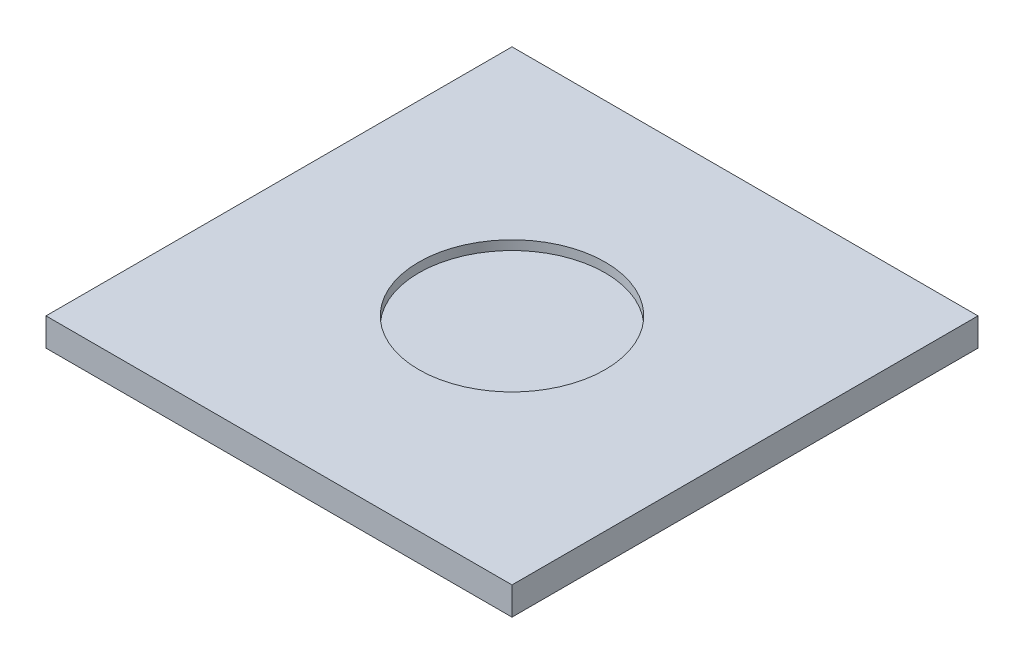
ISO-10303-21;
HEADER;
FILE_DESCRIPTION(('STEP AP214'),'2;1');
FILE_NAME('part.step','',(''),(''),'','','');
FILE_SCHEMA(('AUTOMOTIVE_DESIGN { 1 0 10303 214 1 1 1 1 }'));
ENDSEC;
DATA;
#1=APPLICATION_CONTEXT('core data for automotive mechanical design processes');
#2=APPLICATION_PROTOCOL_DEFINITION('international standard','automotive_design',2000,#1);
#3=PRODUCT_CONTEXT('',#1,'mechanical');
#4=PRODUCT('Part','Part','',(#3));
#5=PRODUCT_RELATED_PRODUCT_CATEGORY('part','',(#4));
#6=PRODUCT_DEFINITION_FORMATION('','',#4);
#7=PRODUCT_DEFINITION_CONTEXT('part definition',#1,'design');
#8=PRODUCT_DEFINITION('design','',#6,#7);
#9=PRODUCT_DEFINITION_SHAPE('','',#8);
#10=(LENGTH_UNIT() NAMED_UNIT(*) SI_UNIT(.MILLI.,.METRE.));
#11=(NAMED_UNIT(*) PLANE_ANGLE_UNIT() SI_UNIT($,.RADIAN.));
#12=(NAMED_UNIT(*) SI_UNIT($,.STERADIAN.) SOLID_ANGLE_UNIT());
#13=UNCERTAINTY_MEASURE_WITH_UNIT(LENGTH_MEASURE(1.E-05),#10,'distance_accuracy_value','');
#14=(GEOMETRIC_REPRESENTATION_CONTEXT(3) GLOBAL_UNCERTAINTY_ASSIGNED_CONTEXT((#13)) GLOBAL_UNIT_ASSIGNED_CONTEXT((#10,
#11,#12)) REPRESENTATION_CONTEXT('',''));
#15=CARTESIAN_POINT('',(0.,0.,0.));
#16=DIRECTION('',(0.,0.,1.));
#17=DIRECTION('',(1.,0.,0.));
#18=AXIS2_PLACEMENT_3D('',#15,#16,#17);
#19=CARTESIAN_POINT('',(125.,15.,-125.));
#20=DIRECTION('',(-1.,0.,0.));
#21=DIRECTION('',(0.,0.,1.));
#22=AXIS2_PLACEMENT_3D('',#19,#20,#21);
#23=PLANE('',#22);
#24=DIRECTION('',(0.,0.,-1.));
#25=VECTOR('',#24,1.);
#26=CARTESIAN_POINT('',(125.,0.,-125.));
#27=LINE('',#26,#25);
#28=CARTESIAN_POINT('',(125.,0.,125.));
#29=VERTEX_POINT('',#28);
#30=CARTESIAN_POINT('',(125.,0.,-125.));
#31=VERTEX_POINT('',#30);
#32=EDGE_CURVE('E111',#29,#31,#27,.T.);
#33=ORIENTED_EDGE('',*,*,#32,.T.);
#34=DIRECTION('',(0.,-1.,0.));
#35=VECTOR('',#34,1.);
#36=CARTESIAN_POINT('',(125.,15.,-125.));
#37=LINE('',#36,#35);
#38=CARTESIAN_POINT('',(125.,15.,-125.));
#39=VERTEX_POINT('',#38);
#40=EDGE_CURVE('E11',#39,#31,#37,.T.);
#41=ORIENTED_EDGE('',*,*,#40,.F.);
#42=DIRECTION('',(0.,0.,-1.));
#43=VECTOR('',#42,1.);
#44=CARTESIAN_POINT('',(125.,15.,-125.));
#45=LINE('',#44,#43);
#46=CARTESIAN_POINT('',(125.,15.,125.));
#47=VERTEX_POINT('',#46);
#48=EDGE_CURVE('E95',#47,#39,#45,.T.);
#49=ORIENTED_EDGE('',*,*,#48,.F.);
#50=DIRECTION('',(0.,-1.,0.));
#51=VECTOR('',#50,1.);
#52=CARTESIAN_POINT('',(125.,15.,125.));
#53=LINE('',#52,#51);
#54=EDGE_CURVE('E107',#47,#29,#53,.T.);
#55=ORIENTED_EDGE('',*,*,#54,.T.);
#56=EDGE_LOOP('',(#33,#41,#49,#55));
#57=FACE_BOUND('',#56,.T.);
#58=ADVANCED_FACE('F43',(#57),#23,.F.);
#59=CARTESIAN_POINT('',(-125.,15.,-125.));
#60=DIRECTION('',(0.,0.,1.));
#61=DIRECTION('',(1.,0.,0.));
#62=AXIS2_PLACEMENT_3D('',#59,#60,#61);
#63=PLANE('',#62);
#64=DIRECTION('',(-1.,0.,0.));
#65=VECTOR('',#64,1.);
#66=CARTESIAN_POINT('',(-125.,0.,-125.));
#67=LINE('',#66,#65);
#68=CARTESIAN_POINT('',(-125.,0.,-125.));
#69=VERTEX_POINT('',#68);
#70=EDGE_CURVE('E100',#31,#69,#67,.T.);
#71=ORIENTED_EDGE('',*,*,#70,.T.);
#72=DIRECTION('',(0.,-1.,0.));
#73=VECTOR('',#72,1.);
#74=CARTESIAN_POINT('',(-125.,15.,-125.));
#75=LINE('',#74,#73);
#76=CARTESIAN_POINT('',(-125.,15.,-125.));
#77=VERTEX_POINT('',#76);
#78=EDGE_CURVE('E52',#77,#69,#75,.T.);
#79=ORIENTED_EDGE('',*,*,#78,.F.);
#80=DIRECTION('',(-1.,0.,0.));
#81=VECTOR('',#80,1.);
#82=CARTESIAN_POINT('',(-125.,15.,-125.));
#83=LINE('',#82,#81);
#84=EDGE_CURVE('E90',#39,#77,#83,.T.);
#85=ORIENTED_EDGE('',*,*,#84,.F.);
#86=ORIENTED_EDGE('',*,*,#40,.T.);
#87=EDGE_LOOP('',(#71,#79,#85,#86));
#88=FACE_BOUND('',#87,.T.);
#89=ADVANCED_FACE('F99',(#88),#63,.F.);
#90=CARTESIAN_POINT('',(-125.,15.,-125.));
#91=DIRECTION('',(1.,0.,0.));
#92=DIRECTION('',(0.,0.,-1.));
#93=AXIS2_PLACEMENT_3D('',#90,#91,#92);
#94=PLANE('',#93);
#95=DIRECTION('',(0.,0.,1.));
#96=VECTOR('',#95,1.);
#97=CARTESIAN_POINT('',(-125.,0.,-125.));
#98=LINE('',#97,#96);
#99=CARTESIAN_POINT('',(-125.,0.,125.));
#100=VERTEX_POINT('',#99);
#101=EDGE_CURVE('E77',#69,#100,#98,.T.);
#102=ORIENTED_EDGE('',*,*,#101,.T.);
#103=DIRECTION('',(0.,-1.,0.));
#104=VECTOR('',#103,1.);
#105=CARTESIAN_POINT('',(-125.,15.,125.));
#106=LINE('',#105,#104);
#107=CARTESIAN_POINT('',(-125.,15.,125.));
#108=VERTEX_POINT('',#107);
#109=EDGE_CURVE('E102',#108,#100,#106,.T.);
#110=ORIENTED_EDGE('',*,*,#109,.F.);
#111=DIRECTION('',(0.,0.,1.));
#112=VECTOR('',#111,1.);
#113=CARTESIAN_POINT('',(-125.,15.,-125.));
#114=LINE('',#113,#112);
#115=EDGE_CURVE('E93',#77,#108,#114,.T.);
#116=ORIENTED_EDGE('',*,*,#115,.F.);
#117=ORIENTED_EDGE('',*,*,#78,.T.);
#118=EDGE_LOOP('',(#102,#110,#116,#117));
#119=FACE_BOUND('',#118,.T.);
#120=ADVANCED_FACE('F103',(#119),#94,.F.);
#121=CARTESIAN_POINT('',(-125.,15.,125.));
#122=DIRECTION('',(0.,0.,-1.));
#123=DIRECTION('',(-1.,0.,0.));
#124=AXIS2_PLACEMENT_3D('',#121,#122,#123);
#125=PLANE('',#124);
#126=DIRECTION('',(1.,0.,0.));
#127=VECTOR('',#126,1.);
#128=CARTESIAN_POINT('',(-125.,0.,125.));
#129=LINE('',#128,#127);
#130=EDGE_CURVE('E83',#100,#29,#129,.T.);
#131=ORIENTED_EDGE('',*,*,#130,.T.);
#132=ORIENTED_EDGE('',*,*,#54,.F.);
#133=DIRECTION('',(1.,0.,0.));
#134=VECTOR('',#133,1.);
#135=CARTESIAN_POINT('',(-125.,15.,125.));
#136=LINE('',#135,#134);
#137=EDGE_CURVE('E60',#108,#47,#136,.T.);
#138=ORIENTED_EDGE('',*,*,#137,.F.);
#139=ORIENTED_EDGE('',*,*,#109,.T.);
#140=EDGE_LOOP('',(#131,#132,#138,#139));
#141=FACE_BOUND('',#140,.T.);
#142=ADVANCED_FACE('F125',(#141),#125,.F.);
#143=CARTESIAN_POINT('',(0.,15.,0.));
#144=DIRECTION('',(0.,1.,0.));
#145=DIRECTION('',(0.,0.,1.));
#146=AXIS2_PLACEMENT_3D('',#143,#144,#145);
#147=PLANE('',#146);
#148=CARTESIAN_POINT('',(0.,15.,0.));
#149=DIRECTION('',(0.,1.,0.));
#150=DIRECTION('',(0.,0.,1.));
#151=AXIS2_PLACEMENT_3D('',#148,#149,#150);
#152=CIRCLE('',#151,50.);
#153=CARTESIAN_POINT('',(0.,15.,50.));
#154=VERTEX_POINT('',#153);
#155=EDGE_CURVE('E132',#154,#154,#152,.T.);
#156=ORIENTED_EDGE('',*,*,#155,.F.);
#157=EDGE_LOOP('',(#156));
#158=FACE_BOUND('',#157,.T.);
#159=ORIENTED_EDGE('',*,*,#48,.T.);
#160=ORIENTED_EDGE('',*,*,#84,.T.);
#161=ORIENTED_EDGE('',*,*,#115,.T.);
#162=ORIENTED_EDGE('',*,*,#137,.T.);
#163=EDGE_LOOP('',(#159,#160,#161,#162));
#164=FACE_BOUND('',#163,.T.);
#165=ADVANCED_FACE('F91',(#158,#164),#147,.T.);
#166=CARTESIAN_POINT('',(0.,0.,0.));
#167=DIRECTION('',(0.,1.,0.));
#168=DIRECTION('',(0.,0.,1.));
#169=AXIS2_PLACEMENT_3D('',#166,#167,#168);
#170=PLANE('',#169);
#171=ORIENTED_EDGE('',*,*,#32,.F.);
#172=ORIENTED_EDGE('',*,*,#130,.F.);
#173=ORIENTED_EDGE('',*,*,#101,.F.);
#174=ORIENTED_EDGE('',*,*,#70,.F.);
#175=EDGE_LOOP('',(#171,#172,#173,#174));
#176=FACE_BOUND('',#175,.T.);
#177=ADVANCED_FACE('F128',(#176),#170,.F.);
#178=CARTESIAN_POINT('',(0.,10.,0.));
#179=DIRECTION('',(0.,1.,0.));
#180=DIRECTION('',(0.,0.,1.));
#181=AXIS2_PLACEMENT_3D('',#178,#179,#180);
#182=CYLINDRICAL_SURFACE('',#181,50.);
#183=CARTESIAN_POINT('',(0.,10.,0.));
#184=DIRECTION('',(0.,1.,0.));
#185=DIRECTION('',(0.,0.,1.));
#186=AXIS2_PLACEMENT_3D('',#183,#184,#185);
#187=CIRCLE('',#186,50.);
#188=CARTESIAN_POINT('',(0.,10.,50.));
#189=VERTEX_POINT('',#188);
#190=EDGE_CURVE('E115',#189,#189,#187,.T.);
#191=ORIENTED_EDGE('',*,*,#190,.F.);
#192=EDGE_LOOP('',(#191));
#193=FACE_BOUND('',#192,.T.);
#194=ORIENTED_EDGE('',*,*,#155,.T.);
#195=EDGE_LOOP('',(#194));
#196=FACE_BOUND('',#195,.T.);
#197=ADVANCED_FACE('F142',(#193,#196),#182,.F.);
#198=CARTESIAN_POINT('',(0.,10.,0.));
#199=DIRECTION('',(0.,1.,0.));
#200=DIRECTION('',(0.,0.,1.));
#201=AXIS2_PLACEMENT_3D('',#198,#199,#200);
#202=PLANE('',#201);
#203=ORIENTED_EDGE('',*,*,#190,.T.);
#204=EDGE_LOOP('',(#203));
#205=FACE_BOUND('',#204,.T.);
#206=ADVANCED_FACE('F140',(#205),#202,.T.);
#207=CLOSED_SHELL('',(#58,#89,#120,#142,#165,#177,#197,#206));
#208=MANIFOLD_SOLID_BREP('B2',#207);
#209=ADVANCED_BREP_SHAPE_REPRESENTATION('',(#18,#208),#14);
#210=SHAPE_DEFINITION_REPRESENTATION(#9,#209);
ENDSEC;
END-ISO-10303-21;
